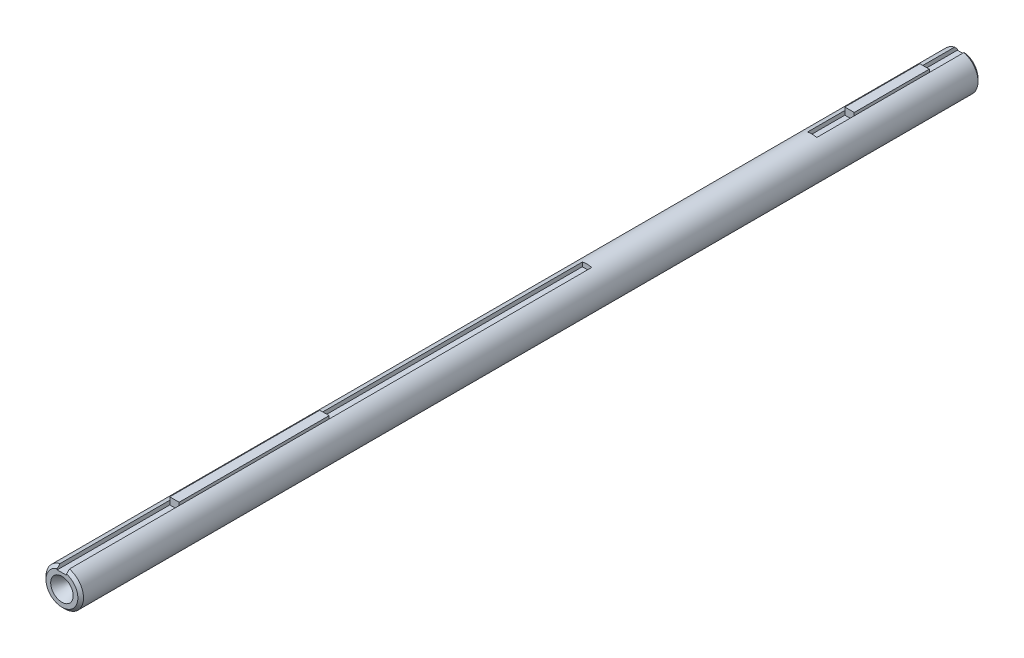
ISO-10303-21;
HEADER;
FILE_DESCRIPTION(('STEP AP214'),'2;1');
FILE_NAME('part.step','',(''),(''),'','','');
FILE_SCHEMA(('AUTOMOTIVE_DESIGN { 1 0 10303 214 1 1 1 1 }'));
ENDSEC;
DATA;
#1=APPLICATION_CONTEXT('core data for automotive mechanical design processes');
#2=APPLICATION_PROTOCOL_DEFINITION('international standard','automotive_design',2000,#1);
#3=PRODUCT_CONTEXT('',#1,'mechanical');
#4=PRODUCT('Part','Part','',(#3));
#5=PRODUCT_RELATED_PRODUCT_CATEGORY('part','',(#4));
#6=PRODUCT_DEFINITION_FORMATION('','',#4);
#7=PRODUCT_DEFINITION_CONTEXT('part definition',#1,'design');
#8=PRODUCT_DEFINITION('design','',#6,#7);
#9=PRODUCT_DEFINITION_SHAPE('','',#8);
#10=(LENGTH_UNIT() NAMED_UNIT(*) SI_UNIT(.MILLI.,.METRE.));
#11=(NAMED_UNIT(*) PLANE_ANGLE_UNIT() SI_UNIT($,.RADIAN.));
#12=(NAMED_UNIT(*) SI_UNIT($,.STERADIAN.) SOLID_ANGLE_UNIT());
#13=UNCERTAINTY_MEASURE_WITH_UNIT(LENGTH_MEASURE(1.E-05),#10,'distance_accuracy_value','');
#14=(GEOMETRIC_REPRESENTATION_CONTEXT(3) GLOBAL_UNCERTAINTY_ASSIGNED_CONTEXT((#13)) GLOBAL_UNIT_ASSIGNED_CONTEXT((#10,
#11,#12)) REPRESENTATION_CONTEXT('',''));
#15=CARTESIAN_POINT('',(0.,0.,0.));
#16=DIRECTION('',(0.,0.,1.));
#17=DIRECTION('',(1.,0.,0.));
#18=AXIS2_PLACEMENT_3D('',#15,#16,#17);
#19=CARTESIAN_POINT('',(-3.175,9.525,-279.4));
#20=DIRECTION('',(1.,0.,0.));
#21=DIRECTION('',(0.,1.,0.));
#22=AXIS2_PLACEMENT_3D('',#19,#20,#21);
#23=PLANE('',#22);
#24=DIRECTION('',(0.,1.,0.));
#25=VECTOR('',#24,1.);
#26=CARTESIAN_POINT('',(-3.175,9.525,-228.6));
#27=LINE('',#26,#25);
#28=CARTESIAN_POINT('',(-3.175,9.525,-228.6));
#29=VERTEX_POINT('',#28);
#30=CARTESIAN_POINT('',(-3.175,14.2875,-228.6));
#31=VERTEX_POINT('',#30);
#32=EDGE_CURVE('E110',#29,#31,#27,.T.);
#33=ORIENTED_EDGE('',*,*,#32,.T.);
#34=DIRECTION('',(0.,0.,1.));
#35=VECTOR('',#34,1.);
#36=CARTESIAN_POINT('',(-3.175,14.2875,-279.4));
#37=LINE('',#36,#35);
#38=CARTESIAN_POINT('',(-3.175,14.2875,-279.4));
#39=VERTEX_POINT('',#38);
#40=EDGE_CURVE('E12',#39,#31,#37,.T.);
#41=ORIENTED_EDGE('',*,*,#40,.F.);
#42=DIRECTION('',(0.,1.,0.));
#43=VECTOR('',#42,1.);
#44=CARTESIAN_POINT('',(-3.175,9.525,-279.4));
#45=LINE('',#44,#43);
#46=CARTESIAN_POINT('',(-3.175,9.525,-279.4));
#47=VERTEX_POINT('',#46);
#48=EDGE_CURVE('E97',#47,#39,#45,.T.);
#49=ORIENTED_EDGE('',*,*,#48,.F.);
#50=DIRECTION('',(0.,0.,1.));
#51=VECTOR('',#50,1.);
#52=CARTESIAN_POINT('',(-3.175,9.525,-279.4));
#53=LINE('',#52,#51);
#54=EDGE_CURVE('E106',#47,#29,#53,.T.);
#55=ORIENTED_EDGE('',*,*,#54,.T.);
#56=EDGE_LOOP('',(#33,#41,#49,#55));
#57=FACE_BOUND('',#56,.T.);
#58=ADVANCED_FACE('F45',(#57),#23,.F.);
#59=CARTESIAN_POINT('',(-3.175,14.2875,-279.4));
#60=DIRECTION('',(0.,-1.,0.));
#61=DIRECTION('',(0.,0.,-1.));
#62=AXIS2_PLACEMENT_3D('',#59,#60,#61);
#63=PLANE('',#62);
#64=DIRECTION('',(1.,0.,0.));
#65=VECTOR('',#64,1.);
#66=CARTESIAN_POINT('',(-3.175,14.2875,-228.6));
#67=LINE('',#66,#65);
#68=CARTESIAN_POINT('',(3.175,14.2875,-228.6));
#69=VERTEX_POINT('',#68);
#70=EDGE_CURVE('E101',#31,#69,#67,.T.);
#71=ORIENTED_EDGE('',*,*,#70,.T.);
#72=DIRECTION('',(0.,0.,1.));
#73=VECTOR('',#72,1.);
#74=CARTESIAN_POINT('',(3.175,14.2875,-279.4));
#75=LINE('',#74,#73);
#76=CARTESIAN_POINT('',(3.175,14.2875,-279.4));
#77=VERTEX_POINT('',#76);
#78=EDGE_CURVE('E54',#77,#69,#75,.T.);
#79=ORIENTED_EDGE('',*,*,#78,.F.);
#80=DIRECTION('',(1.,0.,0.));
#81=VECTOR('',#80,1.);
#82=CARTESIAN_POINT('',(-3.175,14.2875,-279.4));
#83=LINE('',#82,#81);
#84=EDGE_CURVE('E92',#39,#77,#83,.T.);
#85=ORIENTED_EDGE('',*,*,#84,.F.);
#86=ORIENTED_EDGE('',*,*,#40,.T.);
#87=EDGE_LOOP('',(#71,#79,#85,#86));
#88=FACE_BOUND('',#87,.T.);
#89=ADVANCED_FACE('F100',(#88),#63,.F.);
#90=CARTESIAN_POINT('',(3.175,14.2875,-279.4));
#91=DIRECTION('',(-1.,0.,0.));
#92=DIRECTION('',(0.,-1.,0.));
#93=AXIS2_PLACEMENT_3D('',#90,#91,#92);
#94=PLANE('',#93);
#95=DIRECTION('',(0.,-1.,0.));
#96=VECTOR('',#95,1.);
#97=CARTESIAN_POINT('',(3.175,14.2875,-228.6));
#98=LINE('',#97,#96);
#99=CARTESIAN_POINT('',(3.175,9.525,-228.6));
#100=VERTEX_POINT('',#99);
#101=EDGE_CURVE('E79',#69,#100,#98,.T.);
#102=ORIENTED_EDGE('',*,*,#101,.T.);
#103=DIRECTION('',(0.,0.,1.));
#104=VECTOR('',#103,1.);
#105=CARTESIAN_POINT('',(3.175,9.525,-279.4));
#106=LINE('',#105,#104);
#107=CARTESIAN_POINT('',(3.175,9.525,-279.4));
#108=VERTEX_POINT('',#107);
#109=EDGE_CURVE('E103',#108,#100,#106,.T.);
#110=ORIENTED_EDGE('',*,*,#109,.F.);
#111=DIRECTION('',(0.,-1.,0.));
#112=VECTOR('',#111,1.);
#113=CARTESIAN_POINT('',(3.175,14.2875,-279.4));
#114=LINE('',#113,#112);
#115=EDGE_CURVE('E95',#77,#108,#114,.T.);
#116=ORIENTED_EDGE('',*,*,#115,.F.);
#117=ORIENTED_EDGE('',*,*,#78,.T.);
#118=EDGE_LOOP('',(#102,#110,#116,#117));
#119=FACE_BOUND('',#118,.T.);
#120=ADVANCED_FACE('F104',(#119),#94,.F.);
#121=CARTESIAN_POINT('',(3.175,9.525,-279.4));
#122=DIRECTION('',(0.,1.,0.));
#123=DIRECTION('',(0.,0.,1.));
#124=AXIS2_PLACEMENT_3D('',#121,#122,#123);
#125=PLANE('',#124);
#126=DIRECTION('',(-1.,0.,0.));
#127=VECTOR('',#126,1.);
#128=CARTESIAN_POINT('',(3.175,9.525,-228.6));
#129=LINE('',#128,#127);
#130=EDGE_CURVE('E85',#100,#29,#129,.T.);
#131=ORIENTED_EDGE('',*,*,#130,.T.);
#132=ORIENTED_EDGE('',*,*,#54,.F.);
#133=DIRECTION('',(-1.,0.,0.));
#134=VECTOR('',#133,1.);
#135=CARTESIAN_POINT('',(3.175,9.525,-279.4));
#136=LINE('',#135,#134);
#137=EDGE_CURVE('E62',#108,#47,#136,.T.);
#138=ORIENTED_EDGE('',*,*,#137,.F.);
#139=ORIENTED_EDGE('',*,*,#109,.T.);
#140=EDGE_LOOP('',(#131,#132,#138,#139));
#141=FACE_BOUND('',#140,.T.);
#142=ADVANCED_FACE('F119',(#141),#125,.F.);
#143=CARTESIAN_POINT('',(-3.175,14.2875,-279.4));
#144=DIRECTION('',(0.,0.,-1.));
#145=DIRECTION('',(-1.,0.,0.));
#146=AXIS2_PLACEMENT_3D('',#143,#144,#145);
#147=PLANE('',#146);
#148=ORIENTED_EDGE('',*,*,#48,.T.);
#149=ORIENTED_EDGE('',*,*,#84,.T.);
#150=ORIENTED_EDGE('',*,*,#115,.T.);
#151=ORIENTED_EDGE('',*,*,#137,.T.);
#152=EDGE_LOOP('',(#148,#149,#150,#151));
#153=FACE_BOUND('',#152,.T.);
#154=ADVANCED_FACE('F93',(#153),#147,.T.);
#155=CARTESIAN_POINT('',(-3.175,14.2875,-228.6));
#156=DIRECTION('',(0.,0.,-1.));
#157=DIRECTION('',(-1.,0.,0.));
#158=AXIS2_PLACEMENT_3D('',#155,#156,#157);
#159=PLANE('',#158);
#160=ORIENTED_EDGE('',*,*,#32,.F.);
#161=ORIENTED_EDGE('',*,*,#130,.F.);
#162=ORIENTED_EDGE('',*,*,#101,.F.);
#163=ORIENTED_EDGE('',*,*,#70,.F.);
#164=EDGE_LOOP('',(#160,#161,#162,#163));
#165=FACE_BOUND('',#164,.T.);
#166=ADVANCED_FACE('F122',(#165),#159,.F.);
#167=CLOSED_SHELL('',(#58,#89,#120,#142,#154,#166));
#168=MANIFOLD_SOLID_BREP('B2',#167);
#169=CARTESIAN_POINT('',(-3.175,14.2875,127.));
#170=DIRECTION('',(-1.,0.,0.));
#171=DIRECTION('',(0.,-1.,0.));
#172=AXIS2_PLACEMENT_3D('',#169,#170,#171);
#173=PLANE('',#172);
#174=DIRECTION('',(0.,-1.,0.));
#175=VECTOR('',#174,1.);
#176=CARTESIAN_POINT('',(-3.175,14.2875,228.6));
#177=LINE('',#176,#175);
#178=CARTESIAN_POINT('',(-3.175,14.2875,228.6));
#179=VERTEX_POINT('',#178);
#180=CARTESIAN_POINT('',(-3.175,9.525,228.6));
#181=VERTEX_POINT('',#180);
#182=EDGE_CURVE('E254',#179,#181,#177,.T.);
#183=ORIENTED_EDGE('',*,*,#182,.F.);
#184=DIRECTION('',(0.,0.,1.));
#185=VECTOR('',#184,1.);
#186=CARTESIAN_POINT('',(-3.175,14.2875,127.));
#187=LINE('',#186,#185);
#188=CARTESIAN_POINT('',(-3.175,14.2875,127.));
#189=VERTEX_POINT('',#188);
#190=EDGE_CURVE('E43',#189,#179,#187,.T.);
#191=ORIENTED_EDGE('',*,*,#190,.F.);
#192=DIRECTION('',(0.,-1.,0.));
#193=VECTOR('',#192,1.);
#194=CARTESIAN_POINT('',(-3.175,14.2875,127.));
#195=LINE('',#194,#193);
#196=CARTESIAN_POINT('',(-3.175,9.525,127.));
#197=VERTEX_POINT('',#196);
#198=EDGE_CURVE('E248',#189,#197,#195,.T.);
#199=ORIENTED_EDGE('',*,*,#198,.T.);
#200=DIRECTION('',(0.,0.,1.));
#201=VECTOR('',#200,1.);
#202=CARTESIAN_POINT('',(-3.175,9.525,127.));
#203=LINE('',#202,#201);
#204=EDGE_CURVE('E193',#197,#181,#203,.T.);
#205=ORIENTED_EDGE('',*,*,#204,.T.);
#206=EDGE_LOOP('',(#183,#191,#199,#205));
#207=FACE_BOUND('',#206,.T.);
#208=ADVANCED_FACE('F190',(#207),#173,.T.);
#209=CARTESIAN_POINT('',(-3.175,14.2875,127.));
#210=DIRECTION('',(0.,1.,0.));
#211=DIRECTION('',(0.,0.,1.));
#212=AXIS2_PLACEMENT_3D('',#209,#210,#211);
#213=PLANE('',#212);
#214=DIRECTION('',(-1.,0.,0.));
#215=VECTOR('',#214,1.);
#216=CARTESIAN_POINT('',(-3.175,14.2875,228.6));
#217=LINE('',#216,#215);
#218=CARTESIAN_POINT('',(3.175,14.2875,228.6));
#219=VERTEX_POINT('',#218);
#220=EDGE_CURVE('E250',#219,#179,#217,.T.);
#221=ORIENTED_EDGE('',*,*,#220,.F.);
#222=DIRECTION('',(0.,0.,1.));
#223=VECTOR('',#222,1.);
#224=CARTESIAN_POINT('',(3.175,14.2875,127.));
#225=LINE('',#224,#223);
#226=CARTESIAN_POINT('',(3.175,14.2875,127.));
#227=VERTEX_POINT('',#226);
#228=EDGE_CURVE('E199',#227,#219,#225,.T.);
#229=ORIENTED_EDGE('',*,*,#228,.F.);
#230=DIRECTION('',(-1.,0.,0.));
#231=VECTOR('',#230,1.);
#232=CARTESIAN_POINT('',(-3.175,14.2875,127.));
#233=LINE('',#232,#231);
#234=EDGE_CURVE('E245',#227,#189,#233,.T.);
#235=ORIENTED_EDGE('',*,*,#234,.T.);
#236=ORIENTED_EDGE('',*,*,#190,.T.);
#237=EDGE_LOOP('',(#221,#229,#235,#236));
#238=FACE_BOUND('',#237,.T.);
#239=ADVANCED_FACE('F264',(#238),#213,.T.);
#240=CARTESIAN_POINT('',(3.175,14.2875,127.));
#241=DIRECTION('',(1.,0.,0.));
#242=DIRECTION('',(0.,1.,0.));
#243=AXIS2_PLACEMENT_3D('',#240,#241,#242);
#244=PLANE('',#243);
#245=DIRECTION('',(0.,1.,0.));
#246=VECTOR('',#245,1.);
#247=CARTESIAN_POINT('',(3.175,14.2875,228.6));
#248=LINE('',#247,#246);
#249=CARTESIAN_POINT('',(3.175,9.525,228.6));
#250=VERTEX_POINT('',#249);
#251=EDGE_CURVE('E240',#250,#219,#248,.T.);
#252=ORIENTED_EDGE('',*,*,#251,.F.);
#253=DIRECTION('',(0.,0.,1.));
#254=VECTOR('',#253,1.);
#255=CARTESIAN_POINT('',(3.175,9.525,127.));
#256=LINE('',#255,#254);
#257=CARTESIAN_POINT('',(3.175,9.525,127.));
#258=VERTEX_POINT('',#257);
#259=EDGE_CURVE('E235',#258,#250,#256,.T.);
#260=ORIENTED_EDGE('',*,*,#259,.F.);
#261=DIRECTION('',(0.,1.,0.));
#262=VECTOR('',#261,1.);
#263=CARTESIAN_POINT('',(3.175,14.2875,127.));
#264=LINE('',#263,#262);
#265=EDGE_CURVE('E238',#258,#227,#264,.T.);
#266=ORIENTED_EDGE('',*,*,#265,.T.);
#267=ORIENTED_EDGE('',*,*,#228,.T.);
#268=EDGE_LOOP('',(#252,#260,#266,#267));
#269=FACE_BOUND('',#268,.T.);
#270=ADVANCED_FACE('F237',(#269),#244,.T.);
#271=CARTESIAN_POINT('',(-3.175,9.525,127.));
#272=DIRECTION('',(0.,-1.,0.));
#273=DIRECTION('',(0.,0.,-1.));
#274=AXIS2_PLACEMENT_3D('',#271,#272,#273);
#275=PLANE('',#274);
#276=DIRECTION('',(1.,0.,0.));
#277=VECTOR('',#276,1.);
#278=CARTESIAN_POINT('',(-3.175,9.525,228.6));
#279=LINE('',#278,#277);
#280=EDGE_CURVE('E257',#181,#250,#279,.T.);
#281=ORIENTED_EDGE('',*,*,#280,.F.);
#282=ORIENTED_EDGE('',*,*,#204,.F.);
#283=DIRECTION('',(1.,0.,0.));
#284=VECTOR('',#283,1.);
#285=CARTESIAN_POINT('',(-3.175,9.525,127.));
#286=LINE('',#285,#284);
#287=EDGE_CURVE('E244',#197,#258,#286,.T.);
#288=ORIENTED_EDGE('',*,*,#287,.T.);
#289=ORIENTED_EDGE('',*,*,#259,.T.);
#290=EDGE_LOOP('',(#281,#282,#288,#289));
#291=FACE_BOUND('',#290,.T.);
#292=ADVANCED_FACE('F247',(#291),#275,.T.);
#293=CARTESIAN_POINT('',(-3.175,9.525,127.));
#294=DIRECTION('',(0.,0.,1.));
#295=DIRECTION('',(1.,0.,0.));
#296=AXIS2_PLACEMENT_3D('',#293,#294,#295);
#297=PLANE('',#296);
#298=ORIENTED_EDGE('',*,*,#198,.F.);
#299=ORIENTED_EDGE('',*,*,#234,.F.);
#300=ORIENTED_EDGE('',*,*,#265,.F.);
#301=ORIENTED_EDGE('',*,*,#287,.F.);
#302=EDGE_LOOP('',(#298,#299,#300,#301));
#303=FACE_BOUND('',#302,.T.);
#304=ADVANCED_FACE('F243',(#303),#297,.F.);
#305=CARTESIAN_POINT('',(-3.175,9.525,228.6));
#306=DIRECTION('',(0.,0.,1.));
#307=DIRECTION('',(1.,0.,0.));
#308=AXIS2_PLACEMENT_3D('',#305,#306,#307);
#309=PLANE('',#308);
#310=ORIENTED_EDGE('',*,*,#182,.T.);
#311=ORIENTED_EDGE('',*,*,#280,.T.);
#312=ORIENTED_EDGE('',*,*,#251,.T.);
#313=ORIENTED_EDGE('',*,*,#220,.T.);
#314=EDGE_LOOP('',(#310,#311,#312,#313));
#315=FACE_BOUND('',#314,.T.);
#316=ADVANCED_FACE('F263',(#315),#309,.T.);
#317=CLOSED_SHELL('',(#208,#239,#270,#292,#304,#316));
#318=MANIFOLD_SOLID_BREP('B6',#317);
#319=CARTESIAN_POINT('',(-3.175,12.7,-304.8));
#320=DIRECTION('',(-1.,0.,0.));
#321=DIRECTION('',(0.,-1.,0.));
#322=AXIS2_PLACEMENT_3D('',#319,#320,#321);
#323=PLANE('',#322);
#324=DIRECTION('',(0.,1.,0.));
#325=VECTOR('',#324,1.);
#326=CARTESIAN_POINT('',(-3.175,12.7,-203.2));
#327=LINE('',#326,#325);
#328=CARTESIAN_POINT('',(-3.175,9.525,-203.2));
#329=VERTEX_POINT('',#328);
#330=CARTESIAN_POINT('',(-3.175,12.2967221242085,-203.2));
#331=VERTEX_POINT('',#330);
#332=EDGE_CURVE('E457',#329,#331,#327,.T.);
#333=ORIENTED_EDGE('',*,*,#332,.F.);
#334=DIRECTION('',(0.,0.,1.));
#335=VECTOR('',#334,1.);
#336=CARTESIAN_POINT('',(-3.175,9.525,-304.8));
#337=LINE('',#336,#335);
#338=CARTESIAN_POINT('',(-3.175,9.525,-304.8));
#339=VERTEX_POINT('',#338);
#340=EDGE_CURVE('E443',#339,#329,#337,.T.);
#341=ORIENTED_EDGE('',*,*,#340,.F.);
#342=DIRECTION('',(0.,-1.,0.));
#343=VECTOR('',#342,1.);
#344=CARTESIAN_POINT('',(-3.175,12.7,-304.8));
#345=LINE('',#344,#343);
#346=CARTESIAN_POINT('',(-3.175,10.3175287738871,-304.8));
#347=VERTEX_POINT('',#346);
#348=EDGE_CURVE('E464',#347,#339,#345,.T.);
#349=ORIENTED_EDGE('',*,*,#348,.F.);
#350=CARTESIAN_POINT('',(-3.175,5.00937173024059,-309.664196502013));
#351=CARTESIAN_POINT('',(-3.175,5.12467963968368,-309.566794538701));
#352=CARTESIAN_POINT('',(-3.175,5.23951989911774,-309.468842207621));
#353=CARTESIAN_POINT('',(-3.175,5.46838421759475,-309.271992737128));
#354=CARTESIAN_POINT('',(-3.175,5.58240829263697,-309.173095616323));
#355=CARTESIAN_POINT('',(-3.175,5.92342458066583,-308.875230081458));
#356=CARTESIAN_POINT('',(-3.175,6.14937813584759,-308.675072821867));
#357=CARTESIAN_POINT('',(-3.175,6.59915683005544,-308.272467988588));
#358=CARTESIAN_POINT('',(-3.175,6.8229823416072,-308.070020829871));
#359=CARTESIAN_POINT('',(-3.175,7.26902629652584,-307.663355753249));
#360=CARTESIAN_POINT('',(-3.175,7.49124470438234,-307.459137796434));
#361=CARTESIAN_POINT('',(-3.175,7.93435772993702,-307.04938413778));
#362=CARTESIAN_POINT('',(-3.175,8.15525266801065,-306.843848782028));
#363=CARTESIAN_POINT('',(-3.175,8.5960245703692,-306.43169367339));
#364=CARTESIAN_POINT('',(-3.175,8.81590154254219,-306.225073928935));
#365=CARTESIAN_POINT('',(-3.175,9.47432927903627,-305.603892591144));
#366=CARTESIAN_POINT('',(-3.175,9.9116531867852,-305.188030879735));
#367=CARTESIAN_POINT('',(-3.175,10.7839479781505,-304.354096072104));
#368=CARTESIAN_POINT('',(-3.175,11.2189194878172,-303.936023629402));
#369=CARTESIAN_POINT('',(-3.175,12.0872516822016,-303.098229340112));
#370=CARTESIAN_POINT('',(-3.175,12.5206124025178,-302.678507530401));
#371=CARTESIAN_POINT('',(-3.175,13.3862448514882,-301.837764706774));
#372=CARTESIAN_POINT('',(-3.175,13.8185163366832,-301.416743442379));
#373=CARTESIAN_POINT('',(-3.175,14.6821541051119,-300.573758006437));
#374=CARTESIAN_POINT('',(-3.175,15.1135203721462,-300.151793818291));
#375=CARTESIAN_POINT('',(-3.175,15.5445632058881,-299.729500629924));
#376=B_SPLINE_CURVE_WITH_KNOTS('',3,(#350,#351,#352,#353,#354,#355,#356,#357,#358,#359,#360,
#361,#362,#363,#364,#365,#366,#367,#368,#369,#370,#371,#372,#373,#374,#375),.UNSPECIFIED.,.F.,
.F.,(4,2,2,2,2,2,2,2,2,2,2,2,4),(0.,0.452816810908775,0.905624721024938,1.81117254191713,
2.71655880973225,3.62196502210463,4.52714240548252,5.43231276298784,7.24275040676533,
9.05267984842276,10.86256904994,12.6728321405147,14.4831273549287),.UNSPECIFIED.);
#377=CARTESIAN_POINT('',(-3.175,12.2967221242085,-302.894999999999));
#378=VERTEX_POINT('',#377);
#379=EDGE_CURVE('E526',#347,#378,#376,.T.);
#380=ORIENTED_EDGE('',*,*,#379,.T.);
#381=DIRECTION('',(0.,0.,-1.));
#382=VECTOR('',#381,1.);
#383=CARTESIAN_POINT('',(-3.175,12.2967221242085,304.8));
#384=LINE('',#383,#382);
#385=EDGE_CURVE('E334',#331,#378,#384,.T.);
#386=ORIENTED_EDGE('',*,*,#385,.F.);
#387=EDGE_LOOP('',(#333,#341,#349,#380,#386));
#388=FACE_BOUND('',#387,.T.);
#389=ADVANCED_FACE('F318',(#388),#323,.F.);
#390=CARTESIAN_POINT('',(3.175,12.7,-304.8));
#391=DIRECTION('',(1.,0.,0.));
#392=DIRECTION('',(0.,1.,0.));
#393=AXIS2_PLACEMENT_3D('',#390,#391,#392);
#394=PLANE('',#393);
#395=DIRECTION('',(0.,-1.,0.));
#396=VECTOR('',#395,1.);
#397=CARTESIAN_POINT('',(3.175,12.7,-203.2));
#398=LINE('',#397,#396);
#399=CARTESIAN_POINT('',(3.175,12.2967221242085,-203.2));
#400=VERTEX_POINT('',#399);
#401=CARTESIAN_POINT('',(3.175,9.525,-203.2));
#402=VERTEX_POINT('',#401);
#403=EDGE_CURVE('E515',#400,#402,#398,.T.);
#404=ORIENTED_EDGE('',*,*,#403,.F.);
#405=DIRECTION('',(0.,0.,-1.));
#406=VECTOR('',#405,1.);
#407=CARTESIAN_POINT('',(3.175,12.2967221242085,304.8));
#408=LINE('',#407,#406);
#409=CARTESIAN_POINT('',(3.175,12.2967221242085,-302.894999999999));
#410=VERTEX_POINT('',#409);
#411=EDGE_CURVE('E478',#410,#400,#408,.F.);
#412=ORIENTED_EDGE('',*,*,#411,.F.);
#413=CARTESIAN_POINT('',(3.175,15.5445632058881,-299.729500629924));
#414=CARTESIAN_POINT('',(3.175,15.1135203721462,-300.151793818291));
#415=CARTESIAN_POINT('',(3.175,14.6821541051119,-300.573758006437));
#416=CARTESIAN_POINT('',(3.175,13.8185163366832,-301.416743442379));
#417=CARTESIAN_POINT('',(3.175,13.3862448514881,-301.837764706774));
#418=CARTESIAN_POINT('',(3.175,12.5206124025177,-302.678507530401));
#419=CARTESIAN_POINT('',(3.175,12.0872516822016,-303.098229340112));
#420=CARTESIAN_POINT('',(3.175,11.2189194878172,-303.936023629402));
#421=CARTESIAN_POINT('',(3.175,10.7839479781505,-304.354096072104));
#422=CARTESIAN_POINT('',(3.175,9.91165318678522,-305.188030879735));
#423=CARTESIAN_POINT('',(3.175,9.47432927903628,-305.603892591144));
#424=CARTESIAN_POINT('',(3.175,8.81590154254219,-306.225073928935));
#425=CARTESIAN_POINT('',(3.175,8.5960245703692,-306.43169367339));
#426=CARTESIAN_POINT('',(3.175,8.15525266801065,-306.843848782028));
#427=CARTESIAN_POINT('',(3.175,7.93435772993702,-307.04938413778));
#428=CARTESIAN_POINT('',(3.175,7.49124470438235,-307.459137796434));
#429=CARTESIAN_POINT('',(3.175,7.26902629652586,-307.663355753249));
#430=CARTESIAN_POINT('',(3.175,6.82298234160722,-308.070020829871));
#431=CARTESIAN_POINT('',(3.175,6.59915683005544,-308.272467988588));
#432=CARTESIAN_POINT('',(3.175,6.14937813584759,-308.675072821867));
#433=CARTESIAN_POINT('',(3.175,5.92342458066583,-308.875230081458));
#434=CARTESIAN_POINT('',(3.175,5.58240829263699,-309.173095616323));
#435=CARTESIAN_POINT('',(3.175,5.46838421759479,-309.271992737128));
#436=CARTESIAN_POINT('',(3.175,5.23951989911778,-309.468842207621));
#437=CARTESIAN_POINT('',(3.175,5.1246796396837,-309.566794538701));
#438=CARTESIAN_POINT('',(3.175,5.00937173024059,-309.664196502013));
#439=B_SPLINE_CURVE_WITH_KNOTS('',3,(#413,#414,#415,#416,#417,#418,#419,#420,#421,#422,#423,
#424,#425,#426,#427,#428,#429,#430,#431,#432,#433,#434,#435,#436,#437,#438),.UNSPECIFIED.,.F.,
.F.,(4,2,2,2,2,2,2,2,2,2,2,2,4),(0.,1.81029521441406,3.62055830498876,5.43044750650598,
7.2403769481634,9.0508145919409,9.95598494944621,10.8611623328241,11.7665685451965,
12.6719548130116,13.5775026339038,14.0303105440199,14.4831273549287),.UNSPECIFIED.);
#440=CARTESIAN_POINT('',(3.175,10.3175287738871,-304.8));
#441=VERTEX_POINT('',#440);
#442=EDGE_CURVE('E482',#410,#441,#439,.T.);
#443=ORIENTED_EDGE('',*,*,#442,.T.);
#444=DIRECTION('',(0.,1.,0.));
#445=VECTOR('',#444,1.);
#446=CARTESIAN_POINT('',(3.175,12.7,-304.8));
#447=LINE('',#446,#445);
#448=CARTESIAN_POINT('',(3.175,9.525,-304.8));
#449=VERTEX_POINT('',#448);
#450=EDGE_CURVE('E444',#449,#441,#447,.T.);
#451=ORIENTED_EDGE('',*,*,#450,.F.);
#452=DIRECTION('',(0.,0.,1.));
#453=VECTOR('',#452,1.);
#454=CARTESIAN_POINT('',(3.175,9.525,-304.8));
#455=LINE('',#454,#453);
#456=EDGE_CURVE('E472',#449,#402,#455,.T.);
#457=ORIENTED_EDGE('',*,*,#456,.T.);
#458=EDGE_LOOP('',(#404,#412,#443,#451,#457));
#459=FACE_BOUND('',#458,.T.);
#460=ADVANCED_FACE('F414',(#459),#394,.F.);
#461=CARTESIAN_POINT('',(-3.175,9.525,-304.8));
#462=DIRECTION('',(0.,-1.,0.));
#463=DIRECTION('',(0.,0.,-1.));
#464=AXIS2_PLACEMENT_3D('',#461,#462,#463);
#465=PLANE('',#464);
#466=DIRECTION('',(-1.,0.,0.));
#467=VECTOR('',#466,1.);
#468=CARTESIAN_POINT('',(-3.175,9.525,-203.2));
#469=LINE('',#468,#467);
#470=EDGE_CURVE('E327',#402,#329,#469,.T.);
#471=ORIENTED_EDGE('',*,*,#470,.F.);
#472=ORIENTED_EDGE('',*,*,#456,.F.);
#473=DIRECTION('',(1.,0.,0.));
#474=VECTOR('',#473,1.);
#475=CARTESIAN_POINT('',(-3.175,9.525,-304.8));
#476=LINE('',#475,#474);
#477=EDGE_CURVE('E467',#339,#449,#476,.T.);
#478=ORIENTED_EDGE('',*,*,#477,.F.);
#479=ORIENTED_EDGE('',*,*,#340,.T.);
#480=EDGE_LOOP('',(#471,#472,#478,#479));
#481=FACE_BOUND('',#480,.T.);
#482=ADVANCED_FACE('F420',(#481),#465,.F.);
#483=CARTESIAN_POINT('',(0.,0.,304.8));
#484=DIRECTION('',(0.,0.,-1.));
#485=DIRECTION('',(-1.,0.,0.));
#486=AXIS2_PLACEMENT_3D('',#483,#484,#485);
#487=CYLINDRICAL_SURFACE('',#486,12.7);
#488=CARTESIAN_POINT('',(-3.175,12.2967221242085,302.895));
#489=VERTEX_POINT('',#488);
#490=CARTESIAN_POINT('',(-3.175,12.2967221242085,-50.7999999999998));
#491=VERTEX_POINT('',#490);
#492=EDGE_CURVE('E487',#489,#491,#384,.T.);
#493=ORIENTED_EDGE('',*,*,#492,.T.);
#494=CARTESIAN_POINT('',(0.,0.,-50.8));
#495=DIRECTION('',(0.,0.,1.));
#496=DIRECTION('',(1.,0.,0.));
#497=AXIS2_PLACEMENT_3D('',#494,#495,#496);
#498=CIRCLE('',#497,12.7);
#499=CARTESIAN_POINT('',(3.175,12.2967221242085,-50.7999999999998));
#500=VERTEX_POINT('',#499);
#501=EDGE_CURVE('E452',#500,#491,#498,.T.);
#502=ORIENTED_EDGE('',*,*,#501,.F.);
#503=CARTESIAN_POINT('',(3.175,12.2967221242085,302.895));
#504=VERTEX_POINT('',#503);
#505=EDGE_CURVE('E474',#500,#504,#408,.F.);
#506=ORIENTED_EDGE('',*,*,#505,.T.);
#507=CARTESIAN_POINT('',(0.,0.,302.895));
#508=DIRECTION('',(0.,0.,1.));
#509=DIRECTION('',(1.,0.,0.));
#510=AXIS2_PLACEMENT_3D('',#507,#508,#509);
#511=CIRCLE('',#510,12.7);
#512=EDGE_CURVE('E531',#504,#489,#511,.F.);
#513=ORIENTED_EDGE('',*,*,#512,.T.);
#514=EDGE_LOOP('',(#493,#502,#506,#513));
#515=FACE_BOUND('',#514,.T.);
#516=ORIENTED_EDGE('',*,*,#411,.T.);
#517=CARTESIAN_POINT('',(0.,0.,-203.2));
#518=DIRECTION('',(0.,0.,1.));
#519=DIRECTION('',(1.,0.,0.));
#520=AXIS2_PLACEMENT_3D('',#517,#518,#519);
#521=CIRCLE('',#520,12.7);
#522=EDGE_CURVE('E595',#331,#400,#521,.F.);
#523=ORIENTED_EDGE('',*,*,#522,.F.);
#524=ORIENTED_EDGE('',*,*,#385,.T.);
#525=CARTESIAN_POINT('',(0.,0.,-302.894999999999));
#526=DIRECTION('',(0.,0.,1.));
#527=DIRECTION('',(1.,0.,0.));
#528=AXIS2_PLACEMENT_3D('',#525,#526,#527);
#529=CIRCLE('',#528,12.7);
#530=EDGE_CURVE('E530',#378,#410,#529,.T.);
#531=ORIENTED_EDGE('',*,*,#530,.T.);
#532=EDGE_LOOP('',(#516,#523,#524,#531));
#533=FACE_BOUND('',#532,.T.);
#534=ADVANCED_FACE('F557',(#515,#533),#487,.T.);
#535=CARTESIAN_POINT('',(0.,0.,304.8));
#536=DIRECTION('',(0.,0.,1.));
#537=DIRECTION('',(1.,0.,0.));
#538=AXIS2_PLACEMENT_3D('',#535,#536,#537);
#539=PLANE('',#538);
#540=CARTESIAN_POINT('',(0.,-0.238735613056155,304.8));
#541=DIRECTION('',(0.,0.,-1.));
#542=DIRECTION('',(0.,1.,0.));
#543=AXIS2_PLACEMENT_3D('',#540,#541,#542);
#544=CIRCLE('',#543,7.6199999999999);
#545=CARTESIAN_POINT('',(0.,7.38126438694375,304.8));
#546=VERTEX_POINT('',#545);
#547=EDGE_CURVE('E592',#546,#546,#544,.T.);
#548=ORIENTED_EDGE('',*,*,#547,.T.);
#549=EDGE_LOOP('',(#548));
#550=FACE_BOUND('',#549,.T.);
#551=DIRECTION('',(0.,-1.,0.));
#552=VECTOR('',#551,1.);
#553=CARTESIAN_POINT('',(-3.175,12.7,304.8));
#554=LINE('',#553,#552);
#555=CARTESIAN_POINT('',(-3.175,10.317528773888,304.8));
#556=VERTEX_POINT('',#555);
#557=CARTESIAN_POINT('',(-3.175,9.525,304.8));
#558=VERTEX_POINT('',#557);
#559=EDGE_CURVE('E439',#556,#558,#554,.T.);
#560=ORIENTED_EDGE('',*,*,#559,.F.);
#561=CARTESIAN_POINT('',(0.,0.,304.8));
#562=DIRECTION('',(0.,0.,1.));
#563=DIRECTION('',(1.,0.,0.));
#564=AXIS2_PLACEMENT_3D('',#561,#562,#563);
#565=CIRCLE('',#564,10.7950000000003);
#566=CARTESIAN_POINT('',(3.175,10.317528773888,304.8));
#567=VERTEX_POINT('',#566);
#568=EDGE_CURVE('E504',#556,#567,#565,.T.);
#569=ORIENTED_EDGE('',*,*,#568,.T.);
#570=DIRECTION('',(0.,1.,0.));
#571=VECTOR('',#570,1.);
#572=CARTESIAN_POINT('',(3.175,12.7,304.8));
#573=LINE('',#572,#571);
#574=CARTESIAN_POINT('',(3.175,9.525,304.8));
#575=VERTEX_POINT('',#574);
#576=EDGE_CURVE('E462',#575,#567,#573,.T.);
#577=ORIENTED_EDGE('',*,*,#576,.F.);
#578=DIRECTION('',(1.,0.,0.));
#579=VECTOR('',#578,1.);
#580=CARTESIAN_POINT('',(-3.175,9.525,304.8));
#581=LINE('',#580,#579);
#582=EDGE_CURVE('E455',#558,#575,#581,.T.);
#583=ORIENTED_EDGE('',*,*,#582,.F.);
#584=EDGE_LOOP('',(#560,#569,#577,#583));
#585=FACE_BOUND('',#584,.T.);
#586=ADVANCED_FACE('F547',(#550,#585),#539,.T.);
#587=CARTESIAN_POINT('',(0.,0.,-304.8));
#588=DIRECTION('',(0.,0.,1.));
#589=DIRECTION('',(1.,0.,0.));
#590=AXIS2_PLACEMENT_3D('',#587,#588,#589);
#591=PLANE('',#590);
#592=CARTESIAN_POINT('',(0.,-0.238735613056155,-304.8));
#593=DIRECTION('',(0.,0.,-1.));
#594=DIRECTION('',(0.,1.,0.));
#595=AXIS2_PLACEMENT_3D('',#592,#593,#594);
#596=CIRCLE('',#595,7.6199999999999);
#597=CARTESIAN_POINT('',(0.,7.38126438694375,-304.8));
#598=VERTEX_POINT('',#597);
#599=EDGE_CURVE('E575',#598,#598,#596,.T.);
#600=ORIENTED_EDGE('',*,*,#599,.F.);
#601=EDGE_LOOP('',(#600));
#602=FACE_BOUND('',#601,.T.);
#603=CARTESIAN_POINT('',(0.,0.,-304.8));
#604=DIRECTION('',(0.,0.,1.));
#605=DIRECTION('',(1.,0.,0.));
#606=AXIS2_PLACEMENT_3D('',#603,#604,#605);
#607=CIRCLE('',#606,10.7949999999995);
#608=EDGE_CURVE('E524',#441,#347,#607,.F.);
#609=ORIENTED_EDGE('',*,*,#608,.T.);
#610=ORIENTED_EDGE('',*,*,#348,.T.);
#611=ORIENTED_EDGE('',*,*,#477,.T.);
#612=ORIENTED_EDGE('',*,*,#450,.T.);
#613=EDGE_LOOP('',(#609,#610,#611,#612));
#614=FACE_BOUND('',#613,.T.);
#615=ADVANCED_FACE('F523',(#602,#614),#591,.F.);
#616=CARTESIAN_POINT('',(0.,0.,-302.894999999999));
#617=DIRECTION('',(0.,0.,1.));
#618=DIRECTION('',(1.,0.,0.));
#619=AXIS2_PLACEMENT_3D('',#616,#617,#618);
#620=CONICAL_SURFACE('',#619,12.7,0.785398163397422);
#621=ORIENTED_EDGE('',*,*,#379,.F.);
#622=ORIENTED_EDGE('',*,*,#608,.F.);
#623=ORIENTED_EDGE('',*,*,#442,.F.);
#624=ORIENTED_EDGE('',*,*,#530,.F.);
#625=EDGE_LOOP('',(#621,#622,#623,#624));
#626=FACE_BOUND('',#625,.T.);
#627=ADVANCED_FACE('F434',(#626),#620,.T.);
#628=CARTESIAN_POINT('',(0.,0.,304.8));
#629=DIRECTION('',(0.,0.,-1.));
#630=DIRECTION('',(-1.,0.,0.));
#631=AXIS2_PLACEMENT_3D('',#628,#629,#630);
#632=CONICAL_SURFACE('',#631,10.7950000000003,0.785398163397437);
#633=CARTESIAN_POINT('',(-3.175,15.5445632058881,299.729500629925));
#634=CARTESIAN_POINT('',(-3.175,15.1135203721462,300.151793818292));
#635=CARTESIAN_POINT('',(-3.175,14.682154105112,300.573758006438));
#636=CARTESIAN_POINT('',(-3.175,13.8185163366833,301.416743442379));
#637=CARTESIAN_POINT('',(-3.175,13.3862448514883,301.837764706775));
#638=CARTESIAN_POINT('',(-3.175,12.5206124025179,302.678507530402));
#639=CARTESIAN_POINT('',(-3.175,12.0872516822018,303.098229340112));
#640=CARTESIAN_POINT('',(-3.175,11.2189194878174,303.936023629403));
#641=CARTESIAN_POINT('',(-3.175,10.7839479781508,304.354096072105));
#642=CARTESIAN_POINT('',(-3.175,9.91165318678552,305.188030879735));
#643=CARTESIAN_POINT('',(-3.175,9.47432927903662,305.603892591145));
#644=CARTESIAN_POINT('',(-3.175,8.81590154254257,306.225073928935));
#645=CARTESIAN_POINT('',(-3.175,8.59602457036959,306.431693673391));
#646=CARTESIAN_POINT('',(-3.175,8.15525266801107,306.843848782028));
#647=CARTESIAN_POINT('',(-3.175,7.93435772993746,307.04938413778));
#648=CARTESIAN_POINT('',(-3.175,7.49124470438281,307.459137796434));
#649=CARTESIAN_POINT('',(-3.175,7.26902629652633,307.663355753249));
#650=CARTESIAN_POINT('',(-3.175,6.8229823416077,308.070020829871));
#651=CARTESIAN_POINT('',(-3.175,6.59915683005593,308.272467988588));
#652=CARTESIAN_POINT('',(-3.175,6.14937813584813,308.675072821867));
#653=CARTESIAN_POINT('',(-3.175,5.9234245806664,308.875230081458));
#654=CARTESIAN_POINT('',(-3.175,5.58240829263755,309.173095616324));
#655=CARTESIAN_POINT('',(-3.175,5.46838421759533,309.271992737128));
#656=CARTESIAN_POINT('',(-3.175,5.23951989911831,309.468842207622));
#657=CARTESIAN_POINT('',(-3.175,5.12467963968425,309.566794538701));
#658=CARTESIAN_POINT('',(-3.175,5.00937173024117,309.664196502013));
#659=B_SPLINE_CURVE_WITH_KNOTS('',3,(#633,#634,#635,#636,#637,#638,#639,#640,#641,#642,#643,
#644,#645,#646,#647,#648,#649,#650,#651,#652,#653,#654,#655,#656,#657,#658),.UNSPECIFIED.,.F.,
.F.,(4,2,2,2,2,2,2,2,2,2,2,2,4),(0.,1.81029521441391,3.62055830498849,5.43044750650564,
7.24037694816294,9.05081459194034,9.95598494944554,10.8611623328234,11.7665685451957,
12.6719548130107,13.5775026339029,14.030310544019,14.4831273549278),.UNSPECIFIED.);
#660=EDGE_CURVE('E503',#489,#556,#659,.T.);
#661=ORIENTED_EDGE('',*,*,#660,.F.);
#662=ORIENTED_EDGE('',*,*,#512,.F.);
#663=CARTESIAN_POINT('',(3.175,5.00937173024117,309.664196502013));
#664=CARTESIAN_POINT('',(3.175,5.12467963968427,309.566794538701));
#665=CARTESIAN_POINT('',(3.175,5.23951989911832,309.468842207622));
#666=CARTESIAN_POINT('',(3.175,5.46838421759531,309.271992737128));
#667=CARTESIAN_POINT('',(3.175,5.58240829263752,309.173095616324));
#668=CARTESIAN_POINT('',(3.175,5.92342458066636,308.875230081458));
#669=CARTESIAN_POINT('',(3.175,6.14937813584811,308.675072821867));
#670=CARTESIAN_POINT('',(3.175,6.59915683005594,308.272467988588));
#671=CARTESIAN_POINT('',(3.175,6.8229823416077,308.070020829871));
#672=CARTESIAN_POINT('',(3.175,7.26902629652632,307.663355753249));
#673=CARTESIAN_POINT('',(3.175,7.49124470438281,307.459137796434));
#674=CARTESIAN_POINT('',(3.175,7.93435772993746,307.04938413778));
#675=CARTESIAN_POINT('',(3.175,8.15525266801107,306.843848782028));
#676=CARTESIAN_POINT('',(3.175,8.59602457036959,306.431693673391));
#677=CARTESIAN_POINT('',(3.175,8.81590154254257,306.225073928935));
#678=CARTESIAN_POINT('',(3.175,9.47432927903662,305.603892591145));
#679=CARTESIAN_POINT('',(3.175,9.91165318678551,305.188030879735));
#680=CARTESIAN_POINT('',(3.175,10.7839479781507,304.354096072105));
#681=CARTESIAN_POINT('',(3.175,11.2189194878174,303.936023629403));
#682=CARTESIAN_POINT('',(3.175,12.0872516822018,303.098229340112));
#683=CARTESIAN_POINT('',(3.175,12.5206124025179,302.678507530402));
#684=CARTESIAN_POINT('',(3.175,13.3862448514883,301.837764706775));
#685=CARTESIAN_POINT('',(3.175,13.8185163366833,301.416743442379));
#686=CARTESIAN_POINT('',(3.175,14.682154105112,300.573758006438));
#687=CARTESIAN_POINT('',(3.175,15.1135203721462,300.151793818292));
#688=CARTESIAN_POINT('',(3.175,15.5445632058881,299.729500629925));
#689=B_SPLINE_CURVE_WITH_KNOTS('',3,(#663,#664,#665,#666,#667,#668,#669,#670,#671,#672,#673,
#674,#675,#676,#677,#678,#679,#680,#681,#682,#683,#684,#685,#686,#687,#688),.UNSPECIFIED.,.F.,
.F.,(4,2,2,2,2,2,2,2,2,2,2,2,4),(0.,0.452816810908727,0.90562472102488,1.81117254191705,
2.71655880973211,3.62196502210443,4.52714240548225,5.43231276298745,7.24275040676485,
9.05267984842209,10.8625690499393,12.6728321405139,14.4831273549278),.UNSPECIFIED.);
#690=EDGE_CURVE('E496',#567,#504,#689,.T.);
#691=ORIENTED_EDGE('',*,*,#690,.F.);
#692=ORIENTED_EDGE('',*,*,#568,.F.);
#693=EDGE_LOOP('',(#661,#662,#691,#692));
#694=FACE_BOUND('',#693,.T.);
#695=ADVANCED_FACE('F320',(#694),#632,.T.);
#696=CARTESIAN_POINT('',(-3.175,9.525,-50.8000000000001));
#697=VERTEX_POINT('',#696);
#698=EDGE_CURVE('E437',#697,#558,#337,.T.);
#699=ORIENTED_EDGE('',*,*,#698,.F.);
#700=DIRECTION('',(0.,1.,0.));
#701=VECTOR('',#700,1.);
#702=CARTESIAN_POINT('',(-3.175,12.7,-50.8));
#703=LINE('',#702,#701);
#704=EDGE_CURVE('E342',#697,#491,#703,.T.);
#705=ORIENTED_EDGE('',*,*,#704,.T.);
#706=ORIENTED_EDGE('',*,*,#492,.F.);
#707=ORIENTED_EDGE('',*,*,#660,.T.);
#708=ORIENTED_EDGE('',*,*,#559,.T.);
#709=EDGE_LOOP('',(#699,#705,#706,#707,#708));
#710=FACE_BOUND('',#709,.T.);
#711=ADVANCED_FACE('F416',(#710),#323,.F.);
#712=ORIENTED_EDGE('',*,*,#505,.F.);
#713=DIRECTION('',(0.,-1.,0.));
#714=VECTOR('',#713,1.);
#715=CARTESIAN_POINT('',(3.175,12.7,-50.8));
#716=LINE('',#715,#714);
#717=CARTESIAN_POINT('',(3.175,9.525,-50.8000000000001));
#718=VERTEX_POINT('',#717);
#719=EDGE_CURVE('E453',#500,#718,#716,.T.);
#720=ORIENTED_EDGE('',*,*,#719,.T.);
#721=EDGE_CURVE('E475',#718,#575,#455,.T.);
#722=ORIENTED_EDGE('',*,*,#721,.T.);
#723=ORIENTED_EDGE('',*,*,#576,.T.);
#724=ORIENTED_EDGE('',*,*,#690,.T.);
#725=EDGE_LOOP('',(#712,#720,#722,#723,#724));
#726=FACE_BOUND('',#725,.T.);
#727=ADVANCED_FACE('F423',(#726),#394,.F.);
#728=ORIENTED_EDGE('',*,*,#721,.F.);
#729=DIRECTION('',(-1.,0.,0.));
#730=VECTOR('',#729,1.);
#731=CARTESIAN_POINT('',(-3.175,9.525,-50.8));
#732=LINE('',#731,#730);
#733=EDGE_CURVE('E188',#718,#697,#732,.T.);
#734=ORIENTED_EDGE('',*,*,#733,.T.);
#735=ORIENTED_EDGE('',*,*,#698,.T.);
#736=ORIENTED_EDGE('',*,*,#582,.T.);
#737=EDGE_LOOP('',(#728,#734,#735,#736));
#738=FACE_BOUND('',#737,.T.);
#739=ADVANCED_FACE('F432',(#738),#465,.F.);
#740=CARTESIAN_POINT('',(0.,0.,-50.8));
#741=DIRECTION('',(0.,0.,1.));
#742=DIRECTION('',(1.,0.,0.));
#743=AXIS2_PLACEMENT_3D('',#740,#741,#742);
#744=PLANE('',#743);
#745=ORIENTED_EDGE('',*,*,#704,.F.);
#746=ORIENTED_EDGE('',*,*,#733,.F.);
#747=ORIENTED_EDGE('',*,*,#719,.F.);
#748=ORIENTED_EDGE('',*,*,#501,.T.);
#749=EDGE_LOOP('',(#745,#746,#747,#748));
#750=FACE_BOUND('',#749,.T.);
#751=ADVANCED_FACE('F449',(#750),#744,.T.);
#752=CARTESIAN_POINT('',(0.,0.,-203.2));
#753=DIRECTION('',(0.,0.,1.));
#754=DIRECTION('',(1.,0.,0.));
#755=AXIS2_PLACEMENT_3D('',#752,#753,#754);
#756=PLANE('',#755);
#757=ORIENTED_EDGE('',*,*,#470,.T.);
#758=ORIENTED_EDGE('',*,*,#332,.T.);
#759=ORIENTED_EDGE('',*,*,#522,.T.);
#760=ORIENTED_EDGE('',*,*,#403,.T.);
#761=EDGE_LOOP('',(#757,#758,#759,#760));
#762=FACE_BOUND('',#761,.T.);
#763=ADVANCED_FACE('F512',(#762),#756,.F.);
#764=CARTESIAN_POINT('',(0.,-0.238735613056155,297.101034160356));
#765=DIRECTION('',(0.,0.,1.));
#766=DIRECTION('',(0.,-1.,0.));
#767=AXIS2_PLACEMENT_3D('',#764,#765,#766);
#768=CONICAL_SURFACE('',#767,3.1749999999999,0.523598775598303);
#769=ORIENTED_EDGE('',*,*,#547,.F.);
#770=EDGE_LOOP('',(#769));
#771=FACE_BOUND('',#770,.T.);
#772=CARTESIAN_POINT('',(0.,-0.238735613056155,297.101034160356));
#773=DIRECTION('',(0.,0.,-1.));
#774=DIRECTION('',(0.,1.,0.));
#775=AXIS2_PLACEMENT_3D('',#772,#773,#774);
#776=CIRCLE('',#775,3.1749999999999);
#777=CARTESIAN_POINT('',(0.,2.93626438694375,297.101034160356));
#778=VERTEX_POINT('',#777);
#779=EDGE_CURVE('E582',#778,#778,#776,.T.);
#780=ORIENTED_EDGE('',*,*,#779,.T.);
#781=EDGE_LOOP('',(#780));
#782=FACE_BOUND('',#781,.T.);
#783=ADVANCED_FACE('F651',(#771,#782),#768,.F.);
#784=CARTESIAN_POINT('',(0.,-0.238735613056177,-304.8));
#785=DIRECTION('',(0.,0.,-1.));
#786=DIRECTION('',(0.,1.,0.));
#787=AXIS2_PLACEMENT_3D('',#784,#785,#786);
#788=CYLINDRICAL_SURFACE('',#787,3.17499999999991);
#789=ORIENTED_EDGE('',*,*,#779,.F.);
#790=EDGE_LOOP('',(#789));
#791=FACE_BOUND('',#790,.T.);
#792=CARTESIAN_POINT('',(0.,-0.238735613056155,290.751034160356));
#793=DIRECTION('',(0.,0.,-1.));
#794=DIRECTION('',(0.,1.,0.));
#795=AXIS2_PLACEMENT_3D('',#792,#793,#794);
#796=CIRCLE('',#795,3.17499999999991);
#797=CARTESIAN_POINT('',(0.,2.93626438694375,290.751034160356));
#798=VERTEX_POINT('',#797);
#799=EDGE_CURVE('E577',#798,#798,#796,.T.);
#800=ORIENTED_EDGE('',*,*,#799,.T.);
#801=EDGE_LOOP('',(#800));
#802=FACE_BOUND('',#801,.T.);
#803=ADVANCED_FACE('F646',(#791,#802),#788,.F.);
#804=CARTESIAN_POINT('',(0.,-0.238735613056155,288.878930703558));
#805=DIRECTION('',(0.,0.,1.));
#806=DIRECTION('',(0.,-1.,0.));
#807=AXIS2_PLACEMENT_3D('',#804,#805,#806);
#808=CONICAL_SURFACE('',#807,0.,1.03803012926583);
#809=ORIENTED_EDGE('',*,*,#799,.F.);
#810=EDGE_LOOP('',(#809));
#811=FACE_BOUND('',#810,.T.);
#812=CARTESIAN_POINT('',(0.,-0.238735613056155,288.878930703558));
#813=VERTEX_POINT('',#812);
#814=VERTEX_LOOP('',#813);
#815=FACE_BOUND('',#814,.T.);
#816=ADVANCED_FACE('F622',(#811,#815),#808,.F.);
#817=CARTESIAN_POINT('',(0.,-0.238735613056155,-297.101034160356));
#818=DIRECTION('',(0.,0.,-1.));
#819=DIRECTION('',(0.,-1.,0.));
#820=AXIS2_PLACEMENT_3D('',#817,#818,#819);
#821=CONICAL_SURFACE('',#820,3.1749999999999,0.523598775598303);
#822=ORIENTED_EDGE('',*,*,#599,.T.);
#823=EDGE_LOOP('',(#822));
#824=FACE_BOUND('',#823,.T.);
#825=CARTESIAN_POINT('',(0.,-0.238735613056155,-297.101034160356));
#826=DIRECTION('',(0.,0.,-1.));
#827=DIRECTION('',(0.,1.,0.));
#828=AXIS2_PLACEMENT_3D('',#825,#826,#827);
#829=CIRCLE('',#828,3.1749999999999);
#830=CARTESIAN_POINT('',(0.,2.93626438694375,-297.101034160356));
#831=VERTEX_POINT('',#830);
#832=EDGE_CURVE('E578',#831,#831,#829,.T.);
#833=ORIENTED_EDGE('',*,*,#832,.F.);
#834=EDGE_LOOP('',(#833));
#835=FACE_BOUND('',#834,.T.);
#836=ADVANCED_FACE('F409',(#824,#835),#821,.F.);
#837=CARTESIAN_POINT('',(0.,-0.238735613056177,304.8));
#838=DIRECTION('',(0.,0.,1.));
#839=DIRECTION('',(0.,1.,0.));
#840=AXIS2_PLACEMENT_3D('',#837,#838,#839);
#841=CYLINDRICAL_SURFACE('',#840,3.17499999999991);
#842=ORIENTED_EDGE('',*,*,#832,.T.);
#843=EDGE_LOOP('',(#842));
#844=FACE_BOUND('',#843,.T.);
#845=CARTESIAN_POINT('',(0.,-0.238735613056155,-290.751034160356));
#846=DIRECTION('',(0.,0.,-1.));
#847=DIRECTION('',(0.,1.,0.));
#848=AXIS2_PLACEMENT_3D('',#845,#846,#847);
#849=CIRCLE('',#848,3.17499999999991);
#850=CARTESIAN_POINT('',(0.,2.93626438694375,-290.751034160356));
#851=VERTEX_POINT('',#850);
#852=EDGE_CURVE('E585',#851,#851,#849,.T.);
#853=ORIENTED_EDGE('',*,*,#852,.F.);
#854=EDGE_LOOP('',(#853));
#855=FACE_BOUND('',#854,.T.);
#856=ADVANCED_FACE('F403',(#844,#855),#841,.F.);
#857=CARTESIAN_POINT('',(0.,-0.238735613056155,-288.878930703558));
#858=DIRECTION('',(0.,0.,-1.));
#859=DIRECTION('',(0.,-1.,0.));
#860=AXIS2_PLACEMENT_3D('',#857,#858,#859);
#861=CONICAL_SURFACE('',#860,0.,1.03803012926583);
#862=ORIENTED_EDGE('',*,*,#852,.T.);
#863=EDGE_LOOP('',(#862));
#864=FACE_BOUND('',#863,.T.);
#865=CARTESIAN_POINT('',(0.,-0.238735613056155,-288.878930703558));
#866=VERTEX_POINT('',#865);
#867=VERTEX_LOOP('',#866);
#868=FACE_BOUND('',#867,.T.);
#869=ADVANCED_FACE('F401',(#864,#868),#861,.F.);
#870=CLOSED_SHELL('',(#389,#460,#482,#534,#586,#615,#627,#695,#711,#727,#739,#751,#763,#783,
#803,#816,#836,#856,#869));
#871=MANIFOLD_SOLID_BREP('B37',#870);
#872=ADVANCED_BREP_SHAPE_REPRESENTATION('',(#18,#168,#318,#871),#14);
#873=SHAPE_DEFINITION_REPRESENTATION(#9,#872);
ENDSEC;
END-ISO-10303-21;
